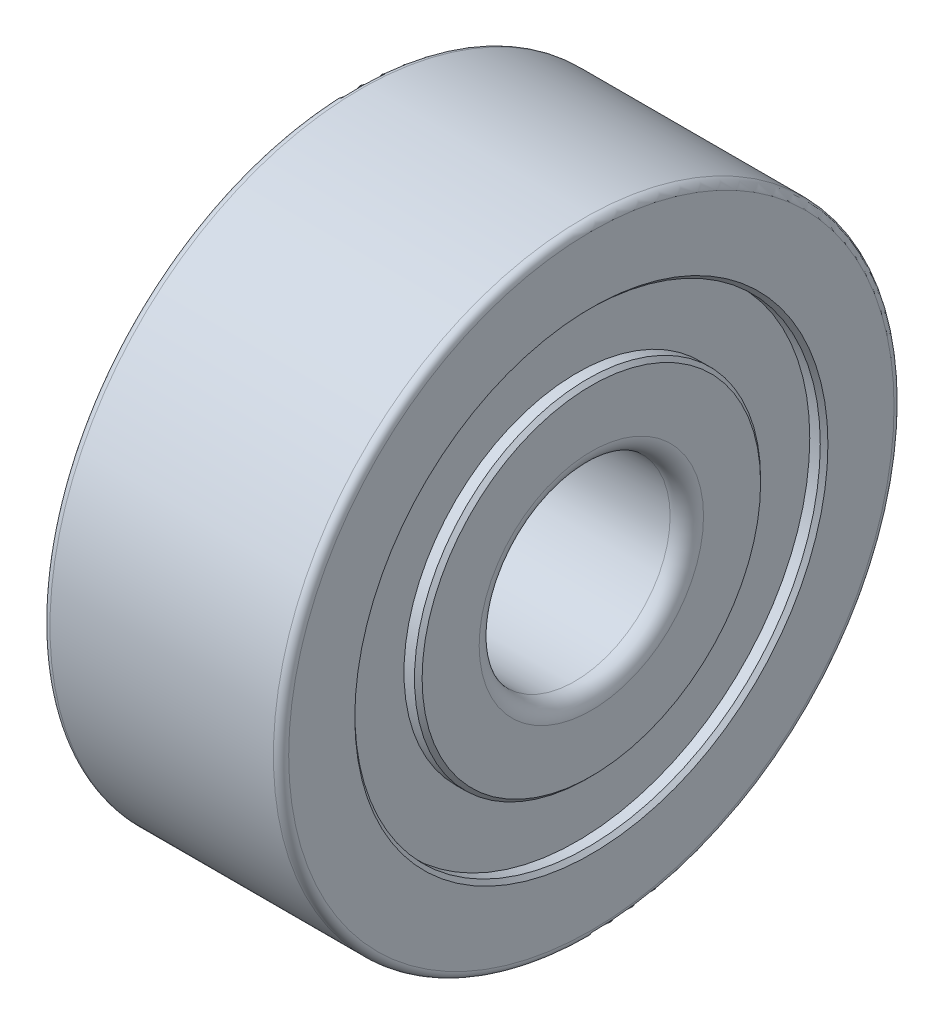
ISO-10303-21;
HEADER;
FILE_DESCRIPTION(('STEP AP214'),'2;1');
FILE_NAME('part.step','',(''),(''),'','','');
FILE_SCHEMA(('AUTOMOTIVE_DESIGN { 1 0 10303 214 1 1 1 1 }'));
ENDSEC;
DATA;
#1=APPLICATION_CONTEXT('core data for automotive mechanical design processes');
#2=APPLICATION_PROTOCOL_DEFINITION('international standard','automotive_design',2000,#1);
#3=PRODUCT_CONTEXT('',#1,'mechanical');
#4=PRODUCT('Part','Part','',(#3));
#5=PRODUCT_RELATED_PRODUCT_CATEGORY('part','',(#4));
#6=PRODUCT_DEFINITION_FORMATION('','',#4);
#7=PRODUCT_DEFINITION_CONTEXT('part definition',#1,'design');
#8=PRODUCT_DEFINITION('design','',#6,#7);
#9=PRODUCT_DEFINITION_SHAPE('','',#8);
#10=(LENGTH_UNIT() NAMED_UNIT(*) SI_UNIT(.MILLI.,.METRE.));
#11=(NAMED_UNIT(*) PLANE_ANGLE_UNIT() SI_UNIT($,.RADIAN.));
#12=(NAMED_UNIT(*) SI_UNIT($,.STERADIAN.) SOLID_ANGLE_UNIT());
#13=UNCERTAINTY_MEASURE_WITH_UNIT(LENGTH_MEASURE(1.E-05),#10,'distance_accuracy_value','');
#14=(GEOMETRIC_REPRESENTATION_CONTEXT(3) GLOBAL_UNCERTAINTY_ASSIGNED_CONTEXT((#13)) GLOBAL_UNIT_ASSIGNED_CONTEXT((#10,
#11,#12)) REPRESENTATION_CONTEXT('',''));
#15=CARTESIAN_POINT('',(0.,0.,0.));
#16=DIRECTION('',(0.,0.,1.));
#17=DIRECTION('',(1.,0.,0.));
#18=AXIS2_PLACEMENT_3D('',#15,#16,#17);
#19=CARTESIAN_POINT('',(-2.5,3.43832222609356,-2.49808732224297));
#20=DIRECTION('',(0.,0.809016994374955,-0.587785252292462));
#21=DIRECTION('',(1.,0.,0.));
#22=AXIS2_PLACEMENT_3D('',#19,#20,#21);
#23=SPHERICAL_SURFACE('',#22,1.25);
#24=CARTESIAN_POINT('',(-2.5,4.44959346906225,-3.23281888760854));
#25=VERTEX_POINT('',#24);
#26=VERTEX_LOOP('',#25);
#27=FACE_BOUND('',#26,.T.);
#28=ADVANCED_FACE('F35',(#27),#23,.T.);
#29=CLOSED_SHELL('',(#28));
#30=MANIFOLD_SOLID_BREP('B2',#29);
#31=CARTESIAN_POINT('',(-2.5,1.31332222609357,-4.04199019425439));
#32=DIRECTION('',(0.,0.309016994374958,-0.95105651629515));
#33=DIRECTION('',(1.,0.,0.));
#34=AXIS2_PLACEMENT_3D('',#31,#32,#33);
#35=SPHERICAL_SURFACE('',#34,1.25);
#36=CARTESIAN_POINT('',(-2.5,1.69959346906227,-5.23081083962333));
#37=VERTEX_POINT('',#36);
#38=VERTEX_LOOP('',#37);
#39=FACE_BOUND('',#38,.T.);
#40=ADVANCED_FACE('F53',(#39),#35,.T.);
#41=CLOSED_SHELL('',(#40));
#42=MANIFOLD_SOLID_BREP('B6',#41);
#43=CARTESIAN_POINT('',(-2.5,-1.31332222609349,-4.04199019425442));
#44=DIRECTION('',(0.,-0.309016994374938,-0.951056516295157));
#45=DIRECTION('',(1.,0.,0.));
#46=AXIS2_PLACEMENT_3D('',#43,#44,#45);
#47=SPHERICAL_SURFACE('',#46,1.25);
#48=CARTESIAN_POINT('',(-2.5,-1.69959346906216,-5.23081083962336));
#49=VERTEX_POINT('',#48);
#50=VERTEX_LOOP('',#49);
#51=FACE_BOUND('',#50,.T.);
#52=ADVANCED_FACE('F71',(#51),#47,.T.);
#53=CLOSED_SHELL('',(#52));
#54=MANIFOLD_SOLID_BREP('B31',#53);
#55=CARTESIAN_POINT('',(-2.5,-3.4383222260935,-2.49808732224304));
#56=DIRECTION('',(0.,-0.809016994374942,-0.58778525229248));
#57=DIRECTION('',(1.,0.,0.));
#58=AXIS2_PLACEMENT_3D('',#55,#56,#57);
#59=SPHERICAL_SURFACE('',#58,1.25);
#60=CARTESIAN_POINT('',(-2.5,-4.44959346906218,-3.23281888760864));
#61=VERTEX_POINT('',#60);
#62=VERTEX_LOOP('',#61);
#63=FACE_BOUND('',#62,.T.);
#64=ADVANCED_FACE('F89',(#63),#59,.T.);
#65=CLOSED_SHELL('',(#64));
#66=MANIFOLD_SOLID_BREP('B49',#65);
#67=CARTESIAN_POINT('',(-2.5,-4.25,0.));
#68=DIRECTION('',(0.,-1.,0.));
#69=DIRECTION('',(1.,0.,0.));
#70=AXIS2_PLACEMENT_3D('',#67,#68,#69);
#71=SPHERICAL_SURFACE('',#70,1.25);
#72=CARTESIAN_POINT('',(-2.5,-5.5,0.));
#73=VERTEX_POINT('',#72);
#74=VERTEX_LOOP('',#73);
#75=FACE_BOUND('',#74,.T.);
#76=ADVANCED_FACE('F107',(#75),#71,.T.);
#77=CLOSED_SHELL('',(#76));
#78=MANIFOLD_SOLID_BREP('B67',#77);
#79=CARTESIAN_POINT('',(-2.5,-3.43832222609354,2.49808732224299));
#80=DIRECTION('',(0.,-0.809016994374951,0.587785252292469));
#81=DIRECTION('',(1.,0.,0.));
#82=AXIS2_PLACEMENT_3D('',#79,#80,#81);
#83=SPHERICAL_SURFACE('',#82,1.25);
#84=CARTESIAN_POINT('',(-2.5,-4.44959346906223,3.23281888760858));
#85=VERTEX_POINT('',#84);
#86=VERTEX_LOOP('',#85);
#87=FACE_BOUND('',#86,.T.);
#88=ADVANCED_FACE('F125',(#87),#83,.T.);
#89=CLOSED_SHELL('',(#88));
#90=MANIFOLD_SOLID_BREP('B85',#89);
#91=CARTESIAN_POINT('',(-2.5,-1.31332222609354,4.0419901942544));
#92=DIRECTION('',(0.,-0.309016994374952,0.951056516295152));
#93=DIRECTION('',(1.,0.,0.));
#94=AXIS2_PLACEMENT_3D('',#91,#92,#93);
#95=SPHERICAL_SURFACE('',#94,1.25);
#96=CARTESIAN_POINT('',(-2.5,-1.69959346906223,5.23081083962334));
#97=VERTEX_POINT('',#96);
#98=VERTEX_LOOP('',#97);
#99=FACE_BOUND('',#98,.T.);
#100=ADVANCED_FACE('F143',(#99),#95,.T.);
#101=CLOSED_SHELL('',(#100));
#102=MANIFOLD_SOLID_BREP('B103',#101);
#103=CARTESIAN_POINT('',(-2.5,1.31332222609352,4.04199019425441));
#104=DIRECTION('',(0.,0.309016994374945,0.951056516295155));
#105=DIRECTION('',(1.,0.,0.));
#106=AXIS2_PLACEMENT_3D('',#103,#104,#105);
#107=SPHERICAL_SURFACE('',#106,1.25);
#108=CARTESIAN_POINT('',(-2.5,1.6995934690622,5.23081083962335));
#109=VERTEX_POINT('',#108);
#110=VERTEX_LOOP('',#109);
#111=FACE_BOUND('',#110,.T.);
#112=ADVANCED_FACE('F161',(#111),#107,.T.);
#113=CLOSED_SHELL('',(#112));
#114=MANIFOLD_SOLID_BREP('B121',#113);
#115=CARTESIAN_POINT('',(-2.5,3.43832222609352,2.49808732224302));
#116=DIRECTION('',(0.,0.809016994374947,0.587785252292474));
#117=DIRECTION('',(1.,0.,0.));
#118=AXIS2_PLACEMENT_3D('',#115,#116,#117);
#119=SPHERICAL_SURFACE('',#118,1.25);
#120=CARTESIAN_POINT('',(-2.5,4.44959346906221,3.23281888760861));
#121=VERTEX_POINT('',#120);
#122=VERTEX_LOOP('',#121);
#123=FACE_BOUND('',#122,.T.);
#124=ADVANCED_FACE('F179',(#123),#119,.T.);
#125=CLOSED_SHELL('',(#124));
#126=MANIFOLD_SOLID_BREP('B139',#125);
#127=CARTESIAN_POINT('',(-2.5,4.25,0.));
#128=DIRECTION('',(0.,1.,0.));
#129=DIRECTION('',(1.,0.,0.));
#130=AXIS2_PLACEMENT_3D('',#127,#128,#129);
#131=SPHERICAL_SURFACE('',#130,1.25);
#132=CARTESIAN_POINT('',(-2.5,5.5,0.));
#133=VERTEX_POINT('',#132);
#134=VERTEX_LOOP('',#133);
#135=FACE_BOUND('',#134,.T.);
#136=ADVANCED_FACE('F199',(#135),#131,.T.);
#137=CLOSED_SHELL('',(#136));
#138=MANIFOLD_SOLID_BREP('B157',#137);
#139=CARTESIAN_POINT('',(0.,0.,0.));
#140=DIRECTION('',(1.,0.,0.));
#141=DIRECTION('',(0.,0.,-1.));
#142=AXIS2_PLACEMENT_3D('',#139,#140,#141);
#143=CYLINDRICAL_SURFACE('',#142,3.625);
#144=CARTESIAN_POINT('',(-3.58253175473055,0.,0.));
#145=DIRECTION('',(1.,0.,0.));
#146=DIRECTION('',(0.,0.,-1.));
#147=AXIS2_PLACEMENT_3D('',#144,#145,#146);
#148=CIRCLE('',#147,3.625);
#149=CARTESIAN_POINT('',(-3.58253175473055,0.,-3.625));
#150=VERTEX_POINT('',#149);
#151=EDGE_CURVE('E229',#150,#150,#148,.T.);
#152=ORIENTED_EDGE('',*,*,#151,.F.);
#153=EDGE_LOOP('',(#152));
#154=FACE_BOUND('',#153,.T.);
#155=CARTESIAN_POINT('',(-4.5,0.,0.));
#156=DIRECTION('',(-1.,0.,0.));
#157=DIRECTION('',(0.,0.,1.));
#158=AXIS2_PLACEMENT_3D('',#155,#156,#157);
#159=CIRCLE('',#158,3.625);
#160=CARTESIAN_POINT('',(-4.5,0.,3.625));
#161=VERTEX_POINT('',#160);
#162=EDGE_CURVE('E275',#161,#161,#159,.T.);
#163=ORIENTED_EDGE('',*,*,#162,.F.);
#164=EDGE_LOOP('',(#163));
#165=FACE_BOUND('',#164,.T.);
#166=ADVANCED_FACE('F218',(#154,#165),#143,.T.);
#167=CARTESIAN_POINT('',(0.,0.,0.));
#168=DIRECTION('',(1.,0.,0.));
#169=DIRECTION('',(0.,0.,-1.));
#170=AXIS2_PLACEMENT_3D('',#167,#168,#169);
#171=CYLINDRICAL_SURFACE('',#170,3.625);
#172=CARTESIAN_POINT('',(-1.41746824526945,0.,0.));
#173=DIRECTION('',(1.,0.,0.));
#174=DIRECTION('',(0.,0.,-1.));
#175=AXIS2_PLACEMENT_3D('',#172,#173,#174);
#176=CIRCLE('',#175,3.625);
#177=CARTESIAN_POINT('',(-1.41746824526945,0.,-3.625));
#178=VERTEX_POINT('',#177);
#179=EDGE_CURVE('E259',#178,#178,#176,.T.);
#180=ORIENTED_EDGE('',*,*,#179,.T.);
#181=EDGE_LOOP('',(#180));
#182=FACE_BOUND('',#181,.T.);
#183=CARTESIAN_POINT('',(-0.5,0.,0.));
#184=DIRECTION('',(1.,0.,0.));
#185=DIRECTION('',(0.,0.,-1.));
#186=AXIS2_PLACEMENT_3D('',#183,#184,#185);
#187=CIRCLE('',#186,3.625);
#188=CARTESIAN_POINT('',(-0.5,0.,-3.625));
#189=VERTEX_POINT('',#188);
#190=EDGE_CURVE('E266',#189,#189,#187,.T.);
#191=ORIENTED_EDGE('',*,*,#190,.F.);
#192=EDGE_LOOP('',(#191));
#193=FACE_BOUND('',#192,.T.);
#194=ADVANCED_FACE('F284',(#182,#193),#171,.T.);
#195=CARTESIAN_POINT('',(-2.5,0.,0.));
#196=DIRECTION('',(1.,0.,0.));
#197=DIRECTION('',(0.,0.,-1.));
#198=AXIS2_PLACEMENT_3D('',#195,#196,#197);
#199=TOROIDAL_SURFACE('',#198,4.25,1.25);
#200=ORIENTED_EDGE('',*,*,#151,.T.);
#201=EDGE_LOOP('',(#200));
#202=FACE_BOUND('',#201,.T.);
#203=ORIENTED_EDGE('',*,*,#179,.F.);
#204=EDGE_LOOP('',(#203));
#205=FACE_BOUND('',#204,.T.);
#206=ADVANCED_FACE('F220',(#202,#205),#199,.F.);
#207=CARTESIAN_POINT('',(-4.7,0.,0.));
#208=DIRECTION('',(-1.,0.,0.));
#209=DIRECTION('',(0.,0.,1.));
#210=AXIS2_PLACEMENT_3D('',#207,#208,#209);
#211=CIRCLE('',#210,3.625);
#212=CARTESIAN_POINT('',(-4.7,0.,3.625));
#213=VERTEX_POINT('',#212);
#214=EDGE_CURVE('E198',#213,#213,#211,.F.);
#215=ORIENTED_EDGE('',*,*,#214,.F.);
#216=EDGE_LOOP('',(#215));
#217=FACE_BOUND('',#216,.T.);
#218=CARTESIAN_POINT('',(-4.92,0.,0.));
#219=DIRECTION('',(1.,0.,0.));
#220=DIRECTION('',(0.,0.,-1.));
#221=AXIS2_PLACEMENT_3D('',#218,#219,#220);
#222=CIRCLE('',#221,3.625);
#223=CARTESIAN_POINT('',(-4.92,0.,-3.625));
#224=VERTEX_POINT('',#223);
#225=EDGE_CURVE('E233',#224,#224,#222,.T.);
#226=ORIENTED_EDGE('',*,*,#225,.T.);
#227=EDGE_LOOP('',(#226));
#228=FACE_BOUND('',#227,.T.);
#229=ADVANCED_FACE('F286',(#217,#228),#143,.T.);
#230=CARTESIAN_POINT('',(-4.92,0.,0.));
#231=DIRECTION('',(1.,0.,0.));
#232=DIRECTION('',(0.,0.,-1.));
#233=AXIS2_PLACEMENT_3D('',#230,#231,#232);
#234=CONICAL_SURFACE('',#233,3.625,0.785398163397448);
#235=CARTESIAN_POINT('',(-5.,0.,0.));
#236=DIRECTION('',(1.,0.,0.));
#237=DIRECTION('',(0.,0.,-1.));
#238=AXIS2_PLACEMENT_3D('',#235,#236,#237);
#239=CIRCLE('',#238,3.545);
#240=CARTESIAN_POINT('',(-5.,0.,-3.545));
#241=VERTEX_POINT('',#240);
#242=EDGE_CURVE('E238',#241,#241,#239,.T.);
#243=ORIENTED_EDGE('',*,*,#242,.T.);
#244=EDGE_LOOP('',(#243));
#245=FACE_BOUND('',#244,.T.);
#246=ORIENTED_EDGE('',*,*,#225,.F.);
#247=EDGE_LOOP('',(#246));
#248=FACE_BOUND('',#247,.T.);
#249=ADVANCED_FACE('F296',(#245,#248),#234,.T.);
#250=CARTESIAN_POINT('',(-5.,2.35,0.));
#251=DIRECTION('',(-1.,0.,0.));
#252=DIRECTION('',(0.,0.,1.));
#253=AXIS2_PLACEMENT_3D('',#250,#251,#252);
#254=PLANE('',#253);
#255=CARTESIAN_POINT('',(-5.,0.,0.));
#256=DIRECTION('',(1.,0.,0.));
#257=DIRECTION('',(0.,0.,-1.));
#258=AXIS2_PLACEMENT_3D('',#255,#256,#257);
#259=CIRCLE('',#258,2.35);
#260=CARTESIAN_POINT('',(-5.,0.,-2.35));
#261=VERTEX_POINT('',#260);
#262=EDGE_CURVE('E241',#261,#261,#259,.T.);
#263=ORIENTED_EDGE('',*,*,#262,.T.);
#264=EDGE_LOOP('',(#263));
#265=FACE_BOUND('',#264,.T.);
#266=ORIENTED_EDGE('',*,*,#242,.F.);
#267=EDGE_LOOP('',(#266));
#268=FACE_BOUND('',#267,.T.);
#269=ADVANCED_FACE('F302',(#265,#268),#254,.T.);
#270=CARTESIAN_POINT('',(-4.65,0.,0.));
#271=DIRECTION('',(1.,0.,0.));
#272=DIRECTION('',(0.,0.,-1.));
#273=AXIS2_PLACEMENT_3D('',#270,#271,#272);
#274=TOROIDAL_SURFACE('',#273,2.35,0.35);
#275=CARTESIAN_POINT('',(-4.65,0.,0.));
#276=DIRECTION('',(1.,0.,0.));
#277=DIRECTION('',(0.,0.,-1.));
#278=AXIS2_PLACEMENT_3D('',#275,#276,#277);
#279=CIRCLE('',#278,2.);
#280=CARTESIAN_POINT('',(-4.65,0.,-2.));
#281=VERTEX_POINT('',#280);
#282=EDGE_CURVE('E244',#281,#281,#279,.T.);
#283=ORIENTED_EDGE('',*,*,#282,.T.);
#284=EDGE_LOOP('',(#283));
#285=FACE_BOUND('',#284,.T.);
#286=ORIENTED_EDGE('',*,*,#262,.F.);
#287=EDGE_LOOP('',(#286));
#288=FACE_BOUND('',#287,.T.);
#289=ADVANCED_FACE('F350',(#285,#288),#274,.T.);
#290=CARTESIAN_POINT('',(0.,0.,0.));
#291=DIRECTION('',(1.,0.,0.));
#292=DIRECTION('',(0.,0.,-1.));
#293=AXIS2_PLACEMENT_3D('',#290,#291,#292);
#294=CYLINDRICAL_SURFACE('',#293,2.);
#295=CARTESIAN_POINT('',(-0.350000000000002,0.,0.));
#296=DIRECTION('',(1.,0.,0.));
#297=DIRECTION('',(0.,0.,-1.));
#298=AXIS2_PLACEMENT_3D('',#295,#296,#297);
#299=CIRCLE('',#298,2.);
#300=CARTESIAN_POINT('',(-0.350000000000002,0.,-2.));
#301=VERTEX_POINT('',#300);
#302=EDGE_CURVE('E247',#301,#301,#299,.T.);
#303=ORIENTED_EDGE('',*,*,#302,.T.);
#304=EDGE_LOOP('',(#303));
#305=FACE_BOUND('',#304,.T.);
#306=ORIENTED_EDGE('',*,*,#282,.F.);
#307=EDGE_LOOP('',(#306));
#308=FACE_BOUND('',#307,.T.);
#309=ADVANCED_FACE('F346',(#305,#308),#294,.F.);
#310=CARTESIAN_POINT('',(-0.35,0.,0.));
#311=DIRECTION('',(1.,0.,0.));
#312=DIRECTION('',(0.,0.,-1.));
#313=AXIS2_PLACEMENT_3D('',#310,#311,#312);
#314=TOROIDAL_SURFACE('',#313,2.35,0.35);
#315=CARTESIAN_POINT('',(0.,0.,0.));
#316=DIRECTION('',(1.,0.,0.));
#317=DIRECTION('',(0.,0.,-1.));
#318=AXIS2_PLACEMENT_3D('',#315,#316,#317);
#319=CIRCLE('',#318,2.35);
#320=CARTESIAN_POINT('',(0.,0.,-2.35));
#321=VERTEX_POINT('',#320);
#322=EDGE_CURVE('E250',#321,#321,#319,.T.);
#323=ORIENTED_EDGE('',*,*,#322,.T.);
#324=EDGE_LOOP('',(#323));
#325=FACE_BOUND('',#324,.T.);
#326=ORIENTED_EDGE('',*,*,#302,.F.);
#327=EDGE_LOOP('',(#326));
#328=FACE_BOUND('',#327,.T.);
#329=ADVANCED_FACE('F342',(#325,#328),#314,.T.);
#330=CARTESIAN_POINT('',(0.,2.35,0.));
#331=DIRECTION('',(1.,0.,0.));
#332=DIRECTION('',(0.,0.,-1.));
#333=AXIS2_PLACEMENT_3D('',#330,#331,#332);
#334=PLANE('',#333);
#335=CARTESIAN_POINT('',(0.,0.,0.));
#336=DIRECTION('',(1.,0.,0.));
#337=DIRECTION('',(0.,0.,-1.));
#338=AXIS2_PLACEMENT_3D('',#335,#336,#337);
#339=CIRCLE('',#338,3.545);
#340=CARTESIAN_POINT('',(0.,0.,-3.545));
#341=VERTEX_POINT('',#340);
#342=EDGE_CURVE('E253',#341,#341,#339,.T.);
#343=ORIENTED_EDGE('',*,*,#342,.T.);
#344=EDGE_LOOP('',(#343));
#345=FACE_BOUND('',#344,.T.);
#346=ORIENTED_EDGE('',*,*,#322,.F.);
#347=EDGE_LOOP('',(#346));
#348=FACE_BOUND('',#347,.T.);
#349=ADVANCED_FACE('F338',(#345,#348),#334,.T.);
#350=CARTESIAN_POINT('',(0.,0.,0.));
#351=DIRECTION('',(-1.,0.,0.));
#352=DIRECTION('',(0.,0.,1.));
#353=AXIS2_PLACEMENT_3D('',#350,#351,#352);
#354=CONICAL_SURFACE('',#353,3.545,0.78539816339745);
#355=CARTESIAN_POINT('',(-0.08,0.,0.));
#356=DIRECTION('',(1.,0.,0.));
#357=DIRECTION('',(0.,0.,-1.));
#358=AXIS2_PLACEMENT_3D('',#355,#356,#357);
#359=CIRCLE('',#358,3.625);
#360=CARTESIAN_POINT('',(-0.08,0.,-3.625));
#361=VERTEX_POINT('',#360);
#362=EDGE_CURVE('E256',#361,#361,#359,.T.);
#363=ORIENTED_EDGE('',*,*,#362,.T.);
#364=EDGE_LOOP('',(#363));
#365=FACE_BOUND('',#364,.T.);
#366=ORIENTED_EDGE('',*,*,#342,.F.);
#367=EDGE_LOOP('',(#366));
#368=FACE_BOUND('',#367,.T.);
#369=ADVANCED_FACE('F334',(#365,#368),#354,.T.);
#370=CARTESIAN_POINT('',(-0.3,0.,0.));
#371=DIRECTION('',(1.,0.,0.));
#372=DIRECTION('',(0.,0.,-1.));
#373=AXIS2_PLACEMENT_3D('',#370,#371,#372);
#374=CIRCLE('',#373,3.625);
#375=CARTESIAN_POINT('',(-0.3,0.,-3.625));
#376=VERTEX_POINT('',#375);
#377=EDGE_CURVE('E225',#376,#376,#374,.F.);
#378=ORIENTED_EDGE('',*,*,#377,.F.);
#379=EDGE_LOOP('',(#378));
#380=FACE_BOUND('',#379,.T.);
#381=ORIENTED_EDGE('',*,*,#362,.F.);
#382=EDGE_LOOP('',(#381));
#383=FACE_BOUND('',#382,.T.);
#384=ADVANCED_FACE('F292',(#380,#383),#171,.T.);
#385=CARTESIAN_POINT('',(-0.3,0.,0.));
#386=DIRECTION('',(1.,0.,0.));
#387=DIRECTION('',(0.,0.,-1.));
#388=AXIS2_PLACEMENT_3D('',#385,#386,#387);
#389=PLANE('',#388);
#390=CARTESIAN_POINT('',(-0.3,0.,0.));
#391=DIRECTION('',(1.,0.,0.));
#392=DIRECTION('',(0.,0.,-1.));
#393=AXIS2_PLACEMENT_3D('',#390,#391,#392);
#394=CIRCLE('',#393,4.875);
#395=CARTESIAN_POINT('',(-0.3,0.,-4.875));
#396=VERTEX_POINT('',#395);
#397=EDGE_CURVE('E262',#396,#396,#394,.T.);
#398=ORIENTED_EDGE('',*,*,#397,.T.);
#399=EDGE_LOOP('',(#398));
#400=FACE_BOUND('',#399,.T.);
#401=ORIENTED_EDGE('',*,*,#377,.T.);
#402=EDGE_LOOP('',(#401));
#403=FACE_BOUND('',#402,.T.);
#404=ADVANCED_FACE('F318',(#400,#403),#389,.T.);
#405=CARTESIAN_POINT('',(-0.5,0.,0.));
#406=DIRECTION('',(1.,0.,0.));
#407=DIRECTION('',(0.,0.,-1.));
#408=AXIS2_PLACEMENT_3D('',#405,#406,#407);
#409=PLANE('',#408);
#410=CARTESIAN_POINT('',(-0.5,0.,0.));
#411=DIRECTION('',(1.,0.,0.));
#412=DIRECTION('',(0.,0.,-1.));
#413=AXIS2_PLACEMENT_3D('',#410,#411,#412);
#414=CIRCLE('',#413,4.875);
#415=CARTESIAN_POINT('',(-0.5,0.,-4.875));
#416=VERTEX_POINT('',#415);
#417=EDGE_CURVE('E263',#416,#416,#414,.T.);
#418=ORIENTED_EDGE('',*,*,#417,.F.);
#419=EDGE_LOOP('',(#418));
#420=FACE_BOUND('',#419,.T.);
#421=ORIENTED_EDGE('',*,*,#190,.T.);
#422=EDGE_LOOP('',(#421));
#423=FACE_BOUND('',#422,.T.);
#424=ADVANCED_FACE('F315',(#420,#423),#409,.F.);
#425=CARTESIAN_POINT('',(-0.3,0.,0.));
#426=DIRECTION('',(-1.,0.,0.));
#427=DIRECTION('',(0.,0.,1.));
#428=AXIS2_PLACEMENT_3D('',#425,#426,#427);
#429=CYLINDRICAL_SURFACE('',#428,4.875);
#430=ORIENTED_EDGE('',*,*,#397,.F.);
#431=EDGE_LOOP('',(#430));
#432=FACE_BOUND('',#431,.T.);
#433=ORIENTED_EDGE('',*,*,#417,.T.);
#434=EDGE_LOOP('',(#433));
#435=FACE_BOUND('',#434,.T.);
#436=ADVANCED_FACE('F317',(#432,#435),#429,.T.);
#437=CARTESIAN_POINT('',(-4.7,0.,0.));
#438=DIRECTION('',(-1.,0.,0.));
#439=DIRECTION('',(0.,0.,1.));
#440=AXIS2_PLACEMENT_3D('',#437,#438,#439);
#441=PLANE('',#440);
#442=CARTESIAN_POINT('',(-4.7,0.,0.));
#443=DIRECTION('',(-1.,0.,0.));
#444=DIRECTION('',(0.,0.,1.));
#445=AXIS2_PLACEMENT_3D('',#442,#443,#444);
#446=CIRCLE('',#445,4.875);
#447=CARTESIAN_POINT('',(-4.7,0.,4.875));
#448=VERTEX_POINT('',#447);
#449=EDGE_CURVE('E271',#448,#448,#446,.T.);
#450=ORIENTED_EDGE('',*,*,#449,.T.);
#451=EDGE_LOOP('',(#450));
#452=FACE_BOUND('',#451,.T.);
#453=ORIENTED_EDGE('',*,*,#214,.T.);
#454=EDGE_LOOP('',(#453));
#455=FACE_BOUND('',#454,.T.);
#456=ADVANCED_FACE('F325',(#452,#455),#441,.T.);
#457=CARTESIAN_POINT('',(-4.5,0.,0.));
#458=DIRECTION('',(-1.,0.,0.));
#459=DIRECTION('',(0.,0.,1.));
#460=AXIS2_PLACEMENT_3D('',#457,#458,#459);
#461=PLANE('',#460);
#462=CARTESIAN_POINT('',(-4.5,0.,0.));
#463=DIRECTION('',(-1.,0.,0.));
#464=DIRECTION('',(0.,0.,1.));
#465=AXIS2_PLACEMENT_3D('',#462,#463,#464);
#466=CIRCLE('',#465,4.875);
#467=CARTESIAN_POINT('',(-4.5,0.,4.875));
#468=VERTEX_POINT('',#467);
#469=EDGE_CURVE('E272',#468,#468,#466,.T.);
#470=ORIENTED_EDGE('',*,*,#469,.F.);
#471=EDGE_LOOP('',(#470));
#472=FACE_BOUND('',#471,.T.);
#473=ORIENTED_EDGE('',*,*,#162,.T.);
#474=EDGE_LOOP('',(#473));
#475=FACE_BOUND('',#474,.T.);
#476=ADVANCED_FACE('F281',(#472,#475),#461,.F.);
#477=CARTESIAN_POINT('',(-4.7,0.,0.));
#478=DIRECTION('',(1.,0.,0.));
#479=DIRECTION('',(0.,0.,-1.));
#480=AXIS2_PLACEMENT_3D('',#477,#478,#479);
#481=CYLINDRICAL_SURFACE('',#480,4.875);
#482=ORIENTED_EDGE('',*,*,#449,.F.);
#483=EDGE_LOOP('',(#482));
#484=FACE_BOUND('',#483,.T.);
#485=ORIENTED_EDGE('',*,*,#469,.T.);
#486=EDGE_LOOP('',(#485));
#487=FACE_BOUND('',#486,.T.);
#488=ADVANCED_FACE('F433',(#484,#487),#481,.T.);
#489=CLOSED_SHELL('',(#166,#194,#206,#229,#249,#269,#289,#309,#329,#349,#369,#384,#404,#424,
#436,#456,#476,#488));
#490=MANIFOLD_SOLID_BREP('B175',#489);
#491=CARTESIAN_POINT('',(-0.08,0.,0.));
#492=DIRECTION('',(1.,0.,0.));
#493=DIRECTION('',(0.,0.,-1.));
#494=AXIS2_PLACEMENT_3D('',#491,#492,#493);
#495=CONICAL_SURFACE('',#494,4.875,0.78539816339745);
#496=CARTESIAN_POINT('',(0.,0.,0.));
#497=DIRECTION('',(1.,0.,0.));
#498=DIRECTION('',(0.,0.,-1.));
#499=AXIS2_PLACEMENT_3D('',#496,#497,#498);
#500=CIRCLE('',#499,4.955);
#501=CARTESIAN_POINT('',(0.,0.,-4.955));
#502=VERTEX_POINT('',#501);
#503=EDGE_CURVE('E217',#502,#502,#500,.T.);
#504=ORIENTED_EDGE('',*,*,#503,.T.);
#505=EDGE_LOOP('',(#504));
#506=FACE_BOUND('',#505,.T.);
#507=CARTESIAN_POINT('',(-0.08,0.,0.));
#508=DIRECTION('',(1.,0.,0.));
#509=DIRECTION('',(0.,0.,-1.));
#510=AXIS2_PLACEMENT_3D('',#507,#508,#509);
#511=CIRCLE('',#510,4.875);
#512=CARTESIAN_POINT('',(-0.08,0.,-4.875));
#513=VERTEX_POINT('',#512);
#514=EDGE_CURVE('E521',#513,#513,#511,.T.);
#515=ORIENTED_EDGE('',*,*,#514,.F.);
#516=EDGE_LOOP('',(#515));
#517=FACE_BOUND('',#516,.T.);
#518=ADVANCED_FACE('F487',(#506,#517),#495,.F.);
#519=CARTESIAN_POINT('',(0.,4.955,0.));
#520=DIRECTION('',(1.,0.,0.));
#521=DIRECTION('',(0.,0.,-1.));
#522=AXIS2_PLACEMENT_3D('',#519,#520,#521);
#523=PLANE('',#522);
#524=CARTESIAN_POINT('',(0.,0.,0.));
#525=DIRECTION('',(1.,0.,0.));
#526=DIRECTION('',(0.,0.,-1.));
#527=AXIS2_PLACEMENT_3D('',#524,#525,#526);
#528=CIRCLE('',#527,6.34);
#529=CARTESIAN_POINT('',(0.,0.,-6.34));
#530=VERTEX_POINT('',#529);
#531=EDGE_CURVE('E493',#530,#530,#528,.T.);
#532=ORIENTED_EDGE('',*,*,#531,.T.);
#533=EDGE_LOOP('',(#532));
#534=FACE_BOUND('',#533,.T.);
#535=ORIENTED_EDGE('',*,*,#503,.F.);
#536=EDGE_LOOP('',(#535));
#537=FACE_BOUND('',#536,.T.);
#538=ADVANCED_FACE('F529',(#534,#537),#523,.T.);
#539=CARTESIAN_POINT('',(-0.16,0.,0.));
#540=DIRECTION('',(1.,0.,0.));
#541=DIRECTION('',(0.,0.,-1.));
#542=AXIS2_PLACEMENT_3D('',#539,#540,#541);
#543=TOROIDAL_SURFACE('',#542,6.34,0.16);
#544=CARTESIAN_POINT('',(-0.160000000000001,0.,0.));
#545=DIRECTION('',(1.,0.,0.));
#546=DIRECTION('',(0.,0.,-1.));
#547=AXIS2_PLACEMENT_3D('',#544,#545,#546);
#548=CIRCLE('',#547,6.5);
#549=CARTESIAN_POINT('',(-0.160000000000001,0.,-6.5));
#550=VERTEX_POINT('',#549);
#551=EDGE_CURVE('E497',#550,#550,#548,.T.);
#552=ORIENTED_EDGE('',*,*,#551,.T.);
#553=EDGE_LOOP('',(#552));
#554=FACE_BOUND('',#553,.T.);
#555=ORIENTED_EDGE('',*,*,#531,.F.);
#556=EDGE_LOOP('',(#555));
#557=FACE_BOUND('',#556,.T.);
#558=ADVANCED_FACE('F533',(#554,#557),#543,.T.);
#559=CARTESIAN_POINT('',(0.,0.,0.));
#560=DIRECTION('',(1.,0.,0.));
#561=DIRECTION('',(0.,0.,-1.));
#562=AXIS2_PLACEMENT_3D('',#559,#560,#561);
#563=CYLINDRICAL_SURFACE('',#562,6.5);
#564=CARTESIAN_POINT('',(-4.84,0.,0.));
#565=DIRECTION('',(1.,0.,0.));
#566=DIRECTION('',(0.,0.,-1.));
#567=AXIS2_PLACEMENT_3D('',#564,#565,#566);
#568=CIRCLE('',#567,6.5);
#569=CARTESIAN_POINT('',(-4.84,0.,-6.5));
#570=VERTEX_POINT('',#569);
#571=EDGE_CURVE('E501',#570,#570,#568,.T.);
#572=ORIENTED_EDGE('',*,*,#571,.T.);
#573=EDGE_LOOP('',(#572));
#574=FACE_BOUND('',#573,.T.);
#575=ORIENTED_EDGE('',*,*,#551,.F.);
#576=EDGE_LOOP('',(#575));
#577=FACE_BOUND('',#576,.T.);
#578=ADVANCED_FACE('F537',(#574,#577),#563,.T.);
#579=CARTESIAN_POINT('',(-4.84,0.,0.));
#580=DIRECTION('',(1.,0.,0.));
#581=DIRECTION('',(0.,0.,-1.));
#582=AXIS2_PLACEMENT_3D('',#579,#580,#581);
#583=TOROIDAL_SURFACE('',#582,6.34,0.16);
#584=CARTESIAN_POINT('',(-5.,0.,0.));
#585=DIRECTION('',(1.,0.,0.));
#586=DIRECTION('',(0.,0.,-1.));
#587=AXIS2_PLACEMENT_3D('',#584,#585,#586);
#588=CIRCLE('',#587,6.34);
#589=CARTESIAN_POINT('',(-5.,0.,-6.34));
#590=VERTEX_POINT('',#589);
#591=EDGE_CURVE('E506',#590,#590,#588,.T.);
#592=ORIENTED_EDGE('',*,*,#591,.T.);
#593=EDGE_LOOP('',(#592));
#594=FACE_BOUND('',#593,.T.);
#595=ORIENTED_EDGE('',*,*,#571,.F.);
#596=EDGE_LOOP('',(#595));
#597=FACE_BOUND('',#596,.T.);
#598=ADVANCED_FACE('F544',(#594,#597),#583,.T.);
#599=CARTESIAN_POINT('',(-5.,4.955,0.));
#600=DIRECTION('',(-1.,0.,0.));
#601=DIRECTION('',(0.,0.,1.));
#602=AXIS2_PLACEMENT_3D('',#599,#600,#601);
#603=PLANE('',#602);
#604=CARTESIAN_POINT('',(-5.,0.,0.));
#605=DIRECTION('',(1.,0.,0.));
#606=DIRECTION('',(0.,0.,-1.));
#607=AXIS2_PLACEMENT_3D('',#604,#605,#606);
#608=CIRCLE('',#607,4.955);
#609=CARTESIAN_POINT('',(-5.,0.,-4.955));
#610=VERTEX_POINT('',#609);
#611=EDGE_CURVE('E509',#610,#610,#608,.T.);
#612=ORIENTED_EDGE('',*,*,#611,.T.);
#613=EDGE_LOOP('',(#612));
#614=FACE_BOUND('',#613,.T.);
#615=ORIENTED_EDGE('',*,*,#591,.F.);
#616=EDGE_LOOP('',(#615));
#617=FACE_BOUND('',#616,.T.);
#618=ADVANCED_FACE('F548',(#614,#617),#603,.T.);
#619=CARTESIAN_POINT('',(-5.,0.,0.));
#620=DIRECTION('',(-1.,0.,0.));
#621=DIRECTION('',(0.,0.,1.));
#622=AXIS2_PLACEMENT_3D('',#619,#620,#621);
#623=CONICAL_SURFACE('',#622,4.955,0.785398163397448);
#624=CARTESIAN_POINT('',(-4.92,0.,0.));
#625=DIRECTION('',(1.,0.,0.));
#626=DIRECTION('',(0.,0.,-1.));
#627=AXIS2_PLACEMENT_3D('',#624,#625,#626);
#628=CIRCLE('',#627,4.875);
#629=CARTESIAN_POINT('',(-4.92,0.,-4.875));
#630=VERTEX_POINT('',#629);
#631=EDGE_CURVE('E512',#630,#630,#628,.T.);
#632=ORIENTED_EDGE('',*,*,#631,.T.);
#633=EDGE_LOOP('',(#632));
#634=FACE_BOUND('',#633,.T.);
#635=ORIENTED_EDGE('',*,*,#611,.F.);
#636=EDGE_LOOP('',(#635));
#637=FACE_BOUND('',#636,.T.);
#638=ADVANCED_FACE('F552',(#634,#637),#623,.F.);
#639=CARTESIAN_POINT('',(0.,0.,0.));
#640=DIRECTION('',(1.,0.,0.));
#641=DIRECTION('',(0.,0.,-1.));
#642=AXIS2_PLACEMENT_3D('',#639,#640,#641);
#643=CYLINDRICAL_SURFACE('',#642,4.875);
#644=CARTESIAN_POINT('',(-3.58253175473055,0.,0.));
#645=DIRECTION('',(1.,0.,0.));
#646=DIRECTION('',(0.,0.,-1.));
#647=AXIS2_PLACEMENT_3D('',#644,#645,#646);
#648=CIRCLE('',#647,4.875);
#649=CARTESIAN_POINT('',(-3.58253175473055,0.,-4.875));
#650=VERTEX_POINT('',#649);
#651=EDGE_CURVE('E515',#650,#650,#648,.T.);
#652=ORIENTED_EDGE('',*,*,#651,.T.);
#653=EDGE_LOOP('',(#652));
#654=FACE_BOUND('',#653,.T.);
#655=ORIENTED_EDGE('',*,*,#631,.F.);
#656=EDGE_LOOP('',(#655));
#657=FACE_BOUND('',#656,.T.);
#658=ADVANCED_FACE('F556',(#654,#657),#643,.F.);
#659=CARTESIAN_POINT('',(-2.5,0.,0.));
#660=DIRECTION('',(1.,0.,0.));
#661=DIRECTION('',(0.,0.,-1.));
#662=AXIS2_PLACEMENT_3D('',#659,#660,#661);
#663=TOROIDAL_SURFACE('',#662,4.25,1.25);
#664=ORIENTED_EDGE('',*,*,#651,.F.);
#665=EDGE_LOOP('',(#664));
#666=FACE_BOUND('',#665,.T.);
#667=CARTESIAN_POINT('',(-1.41746824526945,0.,0.));
#668=DIRECTION('',(1.,0.,0.));
#669=DIRECTION('',(0.,0.,-1.));
#670=AXIS2_PLACEMENT_3D('',#667,#668,#669);
#671=CIRCLE('',#670,4.875);
#672=CARTESIAN_POINT('',(-1.41746824526945,0.,-4.875));
#673=VERTEX_POINT('',#672);
#674=EDGE_CURVE('E518',#673,#673,#671,.T.);
#675=ORIENTED_EDGE('',*,*,#674,.T.);
#676=EDGE_LOOP('',(#675));
#677=FACE_BOUND('',#676,.T.);
#678=ADVANCED_FACE('F560',(#666,#677),#663,.F.);
#679=CARTESIAN_POINT('',(0.,0.,0.));
#680=DIRECTION('',(1.,0.,0.));
#681=DIRECTION('',(0.,0.,-1.));
#682=AXIS2_PLACEMENT_3D('',#679,#680,#681);
#683=CYLINDRICAL_SURFACE('',#682,4.875);
#684=ORIENTED_EDGE('',*,*,#514,.T.);
#685=EDGE_LOOP('',(#684));
#686=FACE_BOUND('',#685,.T.);
#687=ORIENTED_EDGE('',*,*,#674,.F.);
#688=EDGE_LOOP('',(#687));
#689=FACE_BOUND('',#688,.T.);
#690=ADVANCED_FACE('F525',(#686,#689),#683,.F.);
#691=CLOSED_SHELL('',(#518,#538,#558,#578,#598,#618,#638,#658,#678,#690));
#692=MANIFOLD_SOLID_BREP('B193',#691);
#693=ADVANCED_BREP_SHAPE_REPRESENTATION('',(#18,#30,#42,#54,#66,#78,#90,#102,#114,#126,#138,
#490,#692),#14);
#694=SHAPE_DEFINITION_REPRESENTATION(#9,#693);
ENDSEC;
END-ISO-10303-21;
